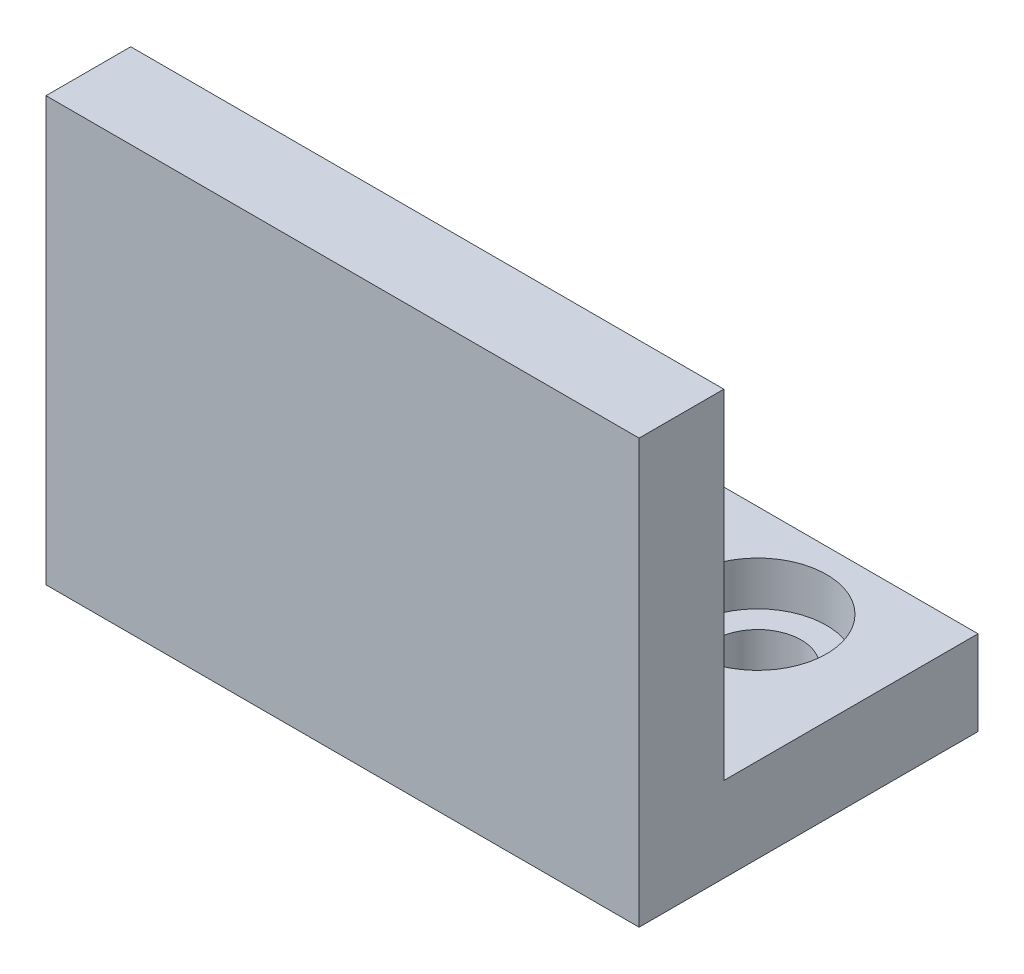
ISO-10303-21;
HEADER;
FILE_DESCRIPTION(('STEP AP214'),'2;1');
FILE_NAME('part.step','',(''),(''),'','','');
FILE_SCHEMA(('AUTOMOTIVE_DESIGN { 1 0 10303 214 1 1 1 1 }'));
ENDSEC;
DATA;
#1=APPLICATION_CONTEXT('core data for automotive mechanical design processes');
#2=APPLICATION_PROTOCOL_DEFINITION('international standard','automotive_design',2000,#1);
#3=PRODUCT_CONTEXT('',#1,'mechanical');
#4=PRODUCT('Part','Part','',(#3));
#5=PRODUCT_RELATED_PRODUCT_CATEGORY('part','',(#4));
#6=PRODUCT_DEFINITION_FORMATION('','',#4);
#7=PRODUCT_DEFINITION_CONTEXT('part definition',#1,'design');
#8=PRODUCT_DEFINITION('design','',#6,#7);
#9=PRODUCT_DEFINITION_SHAPE('','',#8);
#10=(LENGTH_UNIT() NAMED_UNIT(*) SI_UNIT(.MILLI.,.METRE.));
#11=(NAMED_UNIT(*) PLANE_ANGLE_UNIT() SI_UNIT($,.RADIAN.));
#12=(NAMED_UNIT(*) SI_UNIT($,.STERADIAN.) SOLID_ANGLE_UNIT());
#13=UNCERTAINTY_MEASURE_WITH_UNIT(LENGTH_MEASURE(1.E-05),#10,'distance_accuracy_value','');
#14=(GEOMETRIC_REPRESENTATION_CONTEXT(3) GLOBAL_UNCERTAINTY_ASSIGNED_CONTEXT((#13)) GLOBAL_UNIT_ASSIGNED_CONTEXT((#10,
#11,#12)) REPRESENTATION_CONTEXT('',''));
#15=CARTESIAN_POINT('',(0.,0.,0.));
#16=DIRECTION('',(0.,0.,1.));
#17=DIRECTION('',(1.,0.,0.));
#18=AXIS2_PLACEMENT_3D('',#15,#16,#17);
#19=CARTESIAN_POINT('',(44.45,31.75,19.05));
#20=DIRECTION('',(0.,0.,-1.));
#21=DIRECTION('',(-1.,0.,0.));
#22=AXIS2_PLACEMENT_3D('',#19,#20,#21);
#23=PLANE('',#22);
#24=DIRECTION('',(0.,-1.,0.));
#25=VECTOR('',#24,1.);
#26=CARTESIAN_POINT('',(0.,31.75,19.05));
#27=LINE('',#26,#25);
#28=CARTESIAN_POINT('',(0.,31.75,19.05));
#29=VERTEX_POINT('',#28);
#30=CARTESIAN_POINT('',(0.,6.35,19.05));
#31=VERTEX_POINT('',#30);
#32=EDGE_CURVE('E130',#29,#31,#27,.T.);
#33=ORIENTED_EDGE('',*,*,#32,.F.);
#34=DIRECTION('',(-1.,0.,0.));
#35=VECTOR('',#34,1.);
#36=CARTESIAN_POINT('',(44.45,31.75,19.05));
#37=LINE('',#36,#35);
#38=CARTESIAN_POINT('',(44.45,31.75,19.05));
#39=VERTEX_POINT('',#38);
#40=EDGE_CURVE('E11',#39,#29,#37,.T.);
#41=ORIENTED_EDGE('',*,*,#40,.F.);
#42=DIRECTION('',(0.,-1.,0.));
#43=VECTOR('',#42,1.);
#44=CARTESIAN_POINT('',(44.45,31.75,19.05));
#45=LINE('',#44,#43);
#46=CARTESIAN_POINT('',(44.45,6.35,19.05));
#47=VERTEX_POINT('',#46);
#48=EDGE_CURVE('E151',#39,#47,#45,.T.);
#49=ORIENTED_EDGE('',*,*,#48,.T.);
#50=DIRECTION('',(-1.,0.,0.));
#51=VECTOR('',#50,1.);
#52=CARTESIAN_POINT('',(44.45,6.35,19.05));
#53=LINE('',#52,#51);
#54=EDGE_CURVE('E42',#47,#31,#53,.T.);
#55=ORIENTED_EDGE('',*,*,#54,.T.);
#56=EDGE_LOOP('',(#33,#41,#49,#55));
#57=FACE_BOUND('',#56,.T.);
#58=ADVANCED_FACE('F39',(#57),#23,.T.);
#59=CARTESIAN_POINT('',(44.45,31.75,25.4));
#60=DIRECTION('',(0.,1.,0.));
#61=DIRECTION('',(0.,0.,1.));
#62=AXIS2_PLACEMENT_3D('',#59,#60,#61);
#63=PLANE('',#62);
#64=DIRECTION('',(0.,0.,-1.));
#65=VECTOR('',#64,1.);
#66=CARTESIAN_POINT('',(0.,31.75,25.4));
#67=LINE('',#66,#65);
#68=CARTESIAN_POINT('',(0.,31.75,25.4));
#69=VERTEX_POINT('',#68);
#70=EDGE_CURVE('E148',#69,#29,#67,.T.);
#71=ORIENTED_EDGE('',*,*,#70,.F.);
#72=DIRECTION('',(-1.,0.,0.));
#73=VECTOR('',#72,1.);
#74=CARTESIAN_POINT('',(44.45,31.75,25.4));
#75=LINE('',#74,#73);
#76=CARTESIAN_POINT('',(44.45,31.75,25.4));
#77=VERTEX_POINT('',#76);
#78=EDGE_CURVE('E49',#77,#69,#75,.T.);
#79=ORIENTED_EDGE('',*,*,#78,.F.);
#80=DIRECTION('',(0.,0.,-1.));
#81=VECTOR('',#80,1.);
#82=CARTESIAN_POINT('',(44.45,31.75,25.4));
#83=LINE('',#82,#81);
#84=EDGE_CURVE('E116',#77,#39,#83,.T.);
#85=ORIENTED_EDGE('',*,*,#84,.T.);
#86=ORIENTED_EDGE('',*,*,#40,.T.);
#87=EDGE_LOOP('',(#71,#79,#85,#86));
#88=FACE_BOUND('',#87,.T.);
#89=ADVANCED_FACE('F163',(#88),#63,.T.);
#90=CARTESIAN_POINT('',(44.45,0.,25.4));
#91=DIRECTION('',(0.,0.,1.));
#92=DIRECTION('',(0.,-1.,0.));
#93=AXIS2_PLACEMENT_3D('',#90,#91,#92);
#94=PLANE('',#93);
#95=DIRECTION('',(0.,1.,0.));
#96=VECTOR('',#95,1.);
#97=CARTESIAN_POINT('',(0.,0.,25.4));
#98=LINE('',#97,#96);
#99=CARTESIAN_POINT('',(0.,0.,25.4));
#100=VERTEX_POINT('',#99);
#101=EDGE_CURVE('E102',#100,#69,#98,.T.);
#102=ORIENTED_EDGE('',*,*,#101,.F.);
#103=DIRECTION('',(-1.,0.,0.));
#104=VECTOR('',#103,1.);
#105=CARTESIAN_POINT('',(44.45,0.,25.4));
#106=LINE('',#105,#104);
#107=CARTESIAN_POINT('',(44.45,0.,25.4));
#108=VERTEX_POINT('',#107);
#109=EDGE_CURVE('E97',#108,#100,#106,.T.);
#110=ORIENTED_EDGE('',*,*,#109,.F.);
#111=DIRECTION('',(0.,1.,0.));
#112=VECTOR('',#111,1.);
#113=CARTESIAN_POINT('',(44.45,0.,25.4));
#114=LINE('',#113,#112);
#115=EDGE_CURVE('E100',#108,#77,#114,.T.);
#116=ORIENTED_EDGE('',*,*,#115,.T.);
#117=ORIENTED_EDGE('',*,*,#78,.T.);
#118=EDGE_LOOP('',(#102,#110,#116,#117));
#119=FACE_BOUND('',#118,.T.);
#120=ADVANCED_FACE('F99',(#119),#94,.T.);
#121=CARTESIAN_POINT('',(44.45,0.,0.));
#122=DIRECTION('',(0.,-1.,0.));
#123=DIRECTION('',(0.,0.,-1.));
#124=AXIS2_PLACEMENT_3D('',#121,#122,#123);
#125=PLANE('',#124);
#126=CARTESIAN_POINT('',(9.525,0.,6.98499999999999));
#127=DIRECTION('',(0.,1.,0.));
#128=DIRECTION('',(0.,0.,1.));
#129=AXIS2_PLACEMENT_3D('',#126,#127,#128);
#130=CIRCLE('',#129,3.2639);
#131=CARTESIAN_POINT('',(9.525,0.,10.2489));
#132=VERTEX_POINT('',#131);
#133=EDGE_CURVE('E195',#132,#132,#130,.T.);
#134=ORIENTED_EDGE('',*,*,#133,.T.);
#135=EDGE_LOOP('',(#134));
#136=FACE_BOUND('',#135,.T.);
#137=CARTESIAN_POINT('',(34.925,0.,6.98499999999999));
#138=DIRECTION('',(0.,1.,0.));
#139=DIRECTION('',(0.,0.,1.));
#140=AXIS2_PLACEMENT_3D('',#137,#138,#139);
#141=CIRCLE('',#140,3.2639);
#142=CARTESIAN_POINT('',(34.925,0.,10.2489));
#143=VERTEX_POINT('',#142);
#144=EDGE_CURVE('E135',#143,#143,#141,.T.);
#145=ORIENTED_EDGE('',*,*,#144,.T.);
#146=EDGE_LOOP('',(#145));
#147=FACE_BOUND('',#146,.T.);
#148=DIRECTION('',(0.,0.,1.));
#149=VECTOR('',#148,1.);
#150=CARTESIAN_POINT('',(0.,0.,0.));
#151=LINE('',#150,#149);
#152=CARTESIAN_POINT('',(0.,0.,0.));
#153=VERTEX_POINT('',#152);
#154=EDGE_CURVE('E143',#153,#100,#151,.T.);
#155=ORIENTED_EDGE('',*,*,#154,.F.);
#156=DIRECTION('',(-1.,0.,0.));
#157=VECTOR('',#156,1.);
#158=CARTESIAN_POINT('',(44.45,0.,0.));
#159=LINE('',#158,#157);
#160=CARTESIAN_POINT('',(44.45,0.,0.));
#161=VERTEX_POINT('',#160);
#162=EDGE_CURVE('E108',#161,#153,#159,.T.);
#163=ORIENTED_EDGE('',*,*,#162,.F.);
#164=DIRECTION('',(0.,0.,1.));
#165=VECTOR('',#164,1.);
#166=CARTESIAN_POINT('',(44.45,0.,0.));
#167=LINE('',#166,#165);
#168=EDGE_CURVE('E114',#161,#108,#167,.T.);
#169=ORIENTED_EDGE('',*,*,#168,.T.);
#170=ORIENTED_EDGE('',*,*,#109,.T.);
#171=EDGE_LOOP('',(#155,#163,#169,#170));
#172=FACE_BOUND('',#171,.T.);
#173=ADVANCED_FACE('F119',(#136,#147,#172),#125,.T.);
#174=CARTESIAN_POINT('',(44.45,6.35,0.));
#175=DIRECTION('',(0.,0.,-1.));
#176=DIRECTION('',(-1.,0.,0.));
#177=AXIS2_PLACEMENT_3D('',#174,#175,#176);
#178=PLANE('',#177);
#179=DIRECTION('',(0.,-1.,0.));
#180=VECTOR('',#179,1.);
#181=CARTESIAN_POINT('',(0.,6.35,0.));
#182=LINE('',#181,#180);
#183=CARTESIAN_POINT('',(0.,6.35,0.));
#184=VERTEX_POINT('',#183);
#185=EDGE_CURVE('E139',#184,#153,#182,.T.);
#186=ORIENTED_EDGE('',*,*,#185,.F.);
#187=DIRECTION('',(-1.,0.,0.));
#188=VECTOR('',#187,1.);
#189=CARTESIAN_POINT('',(44.45,6.35,0.));
#190=LINE('',#189,#188);
#191=CARTESIAN_POINT('',(44.45,6.35,0.));
#192=VERTEX_POINT('',#191);
#193=EDGE_CURVE('E156',#192,#184,#190,.T.);
#194=ORIENTED_EDGE('',*,*,#193,.F.);
#195=DIRECTION('',(0.,-1.,0.));
#196=VECTOR('',#195,1.);
#197=CARTESIAN_POINT('',(44.45,6.35,0.));
#198=LINE('',#197,#196);
#199=EDGE_CURVE('E121',#192,#161,#198,.T.);
#200=ORIENTED_EDGE('',*,*,#199,.T.);
#201=ORIENTED_EDGE('',*,*,#162,.T.);
#202=EDGE_LOOP('',(#186,#194,#200,#201));
#203=FACE_BOUND('',#202,.T.);
#204=ADVANCED_FACE('F176',(#203),#178,.T.);
#205=CARTESIAN_POINT('',(44.45,6.35,19.05));
#206=DIRECTION('',(0.,1.,0.));
#207=DIRECTION('',(0.,0.,1.));
#208=AXIS2_PLACEMENT_3D('',#205,#206,#207);
#209=PLANE('',#208);
#210=CARTESIAN_POINT('',(9.525,6.35,6.98499999999999));
#211=DIRECTION('',(0.,1.,0.));
#212=DIRECTION('',(0.,0.,1.));
#213=AXIS2_PLACEMENT_3D('',#210,#211,#212);
#214=CIRCLE('',#213,5.15874);
#215=CARTESIAN_POINT('',(9.525,6.35,12.14374));
#216=VERTEX_POINT('',#215);
#217=EDGE_CURVE('E188',#216,#216,#214,.T.);
#218=ORIENTED_EDGE('',*,*,#217,.F.);
#219=EDGE_LOOP('',(#218));
#220=FACE_BOUND('',#219,.T.);
#221=CARTESIAN_POINT('',(34.925,6.35,6.98499999999999));
#222=DIRECTION('',(0.,1.,0.));
#223=DIRECTION('',(0.,0.,1.));
#224=AXIS2_PLACEMENT_3D('',#221,#222,#223);
#225=CIRCLE('',#224,5.15874);
#226=CARTESIAN_POINT('',(34.925,6.35,12.14374));
#227=VERTEX_POINT('',#226);
#228=EDGE_CURVE('E191',#227,#227,#225,.T.);
#229=ORIENTED_EDGE('',*,*,#228,.F.);
#230=EDGE_LOOP('',(#229));
#231=FACE_BOUND('',#230,.T.);
#232=DIRECTION('',(0.,0.,-1.));
#233=VECTOR('',#232,1.);
#234=CARTESIAN_POINT('',(0.,6.35,19.05));
#235=LINE('',#234,#233);
#236=EDGE_CURVE('E134',#31,#184,#235,.T.);
#237=ORIENTED_EDGE('',*,*,#236,.F.);
#238=ORIENTED_EDGE('',*,*,#54,.F.);
#239=DIRECTION('',(0.,0.,-1.));
#240=VECTOR('',#239,1.);
#241=CARTESIAN_POINT('',(44.45,6.35,19.05));
#242=LINE('',#241,#240);
#243=EDGE_CURVE('E124',#47,#192,#242,.T.);
#244=ORIENTED_EDGE('',*,*,#243,.T.);
#245=ORIENTED_EDGE('',*,*,#193,.T.);
#246=EDGE_LOOP('',(#237,#238,#244,#245));
#247=FACE_BOUND('',#246,.T.);
#248=ADVANCED_FACE('F160',(#220,#231,#247),#209,.T.);
#249=CARTESIAN_POINT('',(44.45,0.,0.));
#250=DIRECTION('',(1.,0.,0.));
#251=DIRECTION('',(0.,0.,-1.));
#252=AXIS2_PLACEMENT_3D('',#249,#250,#251);
#253=PLANE('',#252);
#254=ORIENTED_EDGE('',*,*,#48,.F.);
#255=ORIENTED_EDGE('',*,*,#84,.F.);
#256=ORIENTED_EDGE('',*,*,#115,.F.);
#257=ORIENTED_EDGE('',*,*,#168,.F.);
#258=ORIENTED_EDGE('',*,*,#199,.F.);
#259=ORIENTED_EDGE('',*,*,#243,.F.);
#260=EDGE_LOOP('',(#254,#255,#256,#257,#258,#259));
#261=FACE_BOUND('',#260,.T.);
#262=ADVANCED_FACE('F112',(#261),#253,.T.);
#263=CARTESIAN_POINT('',(0.,0.,0.));
#264=DIRECTION('',(1.,0.,0.));
#265=DIRECTION('',(0.,0.,-1.));
#266=AXIS2_PLACEMENT_3D('',#263,#264,#265);
#267=PLANE('',#266);
#268=ORIENTED_EDGE('',*,*,#32,.T.);
#269=ORIENTED_EDGE('',*,*,#236,.T.);
#270=ORIENTED_EDGE('',*,*,#185,.T.);
#271=ORIENTED_EDGE('',*,*,#154,.T.);
#272=ORIENTED_EDGE('',*,*,#101,.T.);
#273=ORIENTED_EDGE('',*,*,#70,.T.);
#274=EDGE_LOOP('',(#268,#269,#270,#271,#272,#273));
#275=FACE_BOUND('',#274,.T.);
#276=ADVANCED_FACE('F162',(#275),#267,.F.);
#277=CARTESIAN_POINT('',(34.925,6.35,6.98499999999999));
#278=DIRECTION('',(0.,1.,0.));
#279=DIRECTION('',(0.,0.,1.));
#280=AXIS2_PLACEMENT_3D('',#277,#278,#279);
#281=CYLINDRICAL_SURFACE('',#280,3.2639);
#282=ORIENTED_EDGE('',*,*,#144,.F.);
#283=EDGE_LOOP('',(#282));
#284=FACE_BOUND('',#283,.T.);
#285=CARTESIAN_POINT('',(34.925,3.048,6.98499999999999));
#286=DIRECTION('',(0.,1.,0.));
#287=DIRECTION('',(0.,0.,1.));
#288=AXIS2_PLACEMENT_3D('',#285,#286,#287);
#289=CIRCLE('',#288,3.2639);
#290=CARTESIAN_POINT('',(34.925,3.048,10.2489));
#291=VERTEX_POINT('',#290);
#292=EDGE_CURVE('E200',#291,#291,#289,.T.);
#293=ORIENTED_EDGE('',*,*,#292,.T.);
#294=EDGE_LOOP('',(#293));
#295=FACE_BOUND('',#294,.T.);
#296=ADVANCED_FACE('F218',(#284,#295),#281,.F.);
#297=CARTESIAN_POINT('',(38.1889,3.048,6.98499999999999));
#298=DIRECTION('',(0.,-1.,0.));
#299=DIRECTION('',(0.,0.,-1.));
#300=AXIS2_PLACEMENT_3D('',#297,#298,#299);
#301=PLANE('',#300);
#302=ORIENTED_EDGE('',*,*,#292,.F.);
#303=EDGE_LOOP('',(#302));
#304=FACE_BOUND('',#303,.T.);
#305=CARTESIAN_POINT('',(34.925,3.048,6.98499999999999));
#306=DIRECTION('',(0.,1.,0.));
#307=DIRECTION('',(0.,0.,1.));
#308=AXIS2_PLACEMENT_3D('',#305,#306,#307);
#309=CIRCLE('',#308,5.15874);
#310=CARTESIAN_POINT('',(34.925,3.048,12.14374));
#311=VERTEX_POINT('',#310);
#312=EDGE_CURVE('E194',#311,#311,#309,.T.);
#313=ORIENTED_EDGE('',*,*,#312,.T.);
#314=EDGE_LOOP('',(#313));
#315=FACE_BOUND('',#314,.T.);
#316=ADVANCED_FACE('F221',(#304,#315),#301,.F.);
#317=CARTESIAN_POINT('',(34.925,6.35,6.98499999999999));
#318=DIRECTION('',(0.,1.,0.));
#319=DIRECTION('',(0.,0.,1.));
#320=AXIS2_PLACEMENT_3D('',#317,#318,#319);
#321=CYLINDRICAL_SURFACE('',#320,5.15874);
#322=ORIENTED_EDGE('',*,*,#312,.F.);
#323=EDGE_LOOP('',(#322));
#324=FACE_BOUND('',#323,.T.);
#325=ORIENTED_EDGE('',*,*,#228,.T.);
#326=EDGE_LOOP('',(#325));
#327=FACE_BOUND('',#326,.T.);
#328=ADVANCED_FACE('F227',(#324,#327),#321,.F.);
#329=CARTESIAN_POINT('',(9.525,6.35,6.98499999999999));
#330=DIRECTION('',(0.,1.,0.));
#331=DIRECTION('',(0.,0.,1.));
#332=AXIS2_PLACEMENT_3D('',#329,#330,#331);
#333=CYLINDRICAL_SURFACE('',#332,3.2639);
#334=ORIENTED_EDGE('',*,*,#133,.F.);
#335=EDGE_LOOP('',(#334));
#336=FACE_BOUND('',#335,.T.);
#337=CARTESIAN_POINT('',(9.525,3.048,6.98499999999999));
#338=DIRECTION('',(0.,1.,0.));
#339=DIRECTION('',(0.,0.,1.));
#340=AXIS2_PLACEMENT_3D('',#337,#338,#339);
#341=CIRCLE('',#340,3.2639);
#342=CARTESIAN_POINT('',(9.525,3.048,10.2489));
#343=VERTEX_POINT('',#342);
#344=EDGE_CURVE('E203',#343,#343,#341,.T.);
#345=ORIENTED_EDGE('',*,*,#344,.T.);
#346=EDGE_LOOP('',(#345));
#347=FACE_BOUND('',#346,.T.);
#348=ADVANCED_FACE('F232',(#336,#347),#333,.F.);
#349=CARTESIAN_POINT('',(12.7889,3.048,6.98499999999999));
#350=DIRECTION('',(0.,-1.,0.));
#351=DIRECTION('',(0.,0.,-1.));
#352=AXIS2_PLACEMENT_3D('',#349,#350,#351);
#353=PLANE('',#352);
#354=ORIENTED_EDGE('',*,*,#344,.F.);
#355=EDGE_LOOP('',(#354));
#356=FACE_BOUND('',#355,.T.);
#357=CARTESIAN_POINT('',(9.525,3.048,6.98499999999999));
#358=DIRECTION('',(0.,1.,0.));
#359=DIRECTION('',(0.,0.,1.));
#360=AXIS2_PLACEMENT_3D('',#357,#358,#359);
#361=CIRCLE('',#360,5.15874);
#362=CARTESIAN_POINT('',(9.525,3.048,12.14374));
#363=VERTEX_POINT('',#362);
#364=EDGE_CURVE('E252',#363,#363,#361,.T.);
#365=ORIENTED_EDGE('',*,*,#364,.T.);
#366=EDGE_LOOP('',(#365));
#367=FACE_BOUND('',#366,.T.);
#368=ADVANCED_FACE('F237',(#356,#367),#353,.F.);
#369=CARTESIAN_POINT('',(9.525,6.35,6.98499999999999));
#370=DIRECTION('',(0.,1.,0.));
#371=DIRECTION('',(0.,0.,1.));
#372=AXIS2_PLACEMENT_3D('',#369,#370,#371);
#373=CYLINDRICAL_SURFACE('',#372,5.15874);
#374=ORIENTED_EDGE('',*,*,#364,.F.);
#375=EDGE_LOOP('',(#374));
#376=FACE_BOUND('',#375,.T.);
#377=ORIENTED_EDGE('',*,*,#217,.T.);
#378=EDGE_LOOP('',(#377));
#379=FACE_BOUND('',#378,.T.);
#380=ADVANCED_FACE('F243',(#376,#379),#373,.F.);
#381=CLOSED_SHELL('',(#58,#89,#120,#173,#204,#248,#262,#276,#296,#316,#328,#348,#368,#380));
#382=MANIFOLD_SOLID_BREP('B2',#381);
#383=ADVANCED_BREP_SHAPE_REPRESENTATION('',(#18,#382),#14);
#384=SHAPE_DEFINITION_REPRESENTATION(#9,#383);
ENDSEC;
END-ISO-10303-21;
